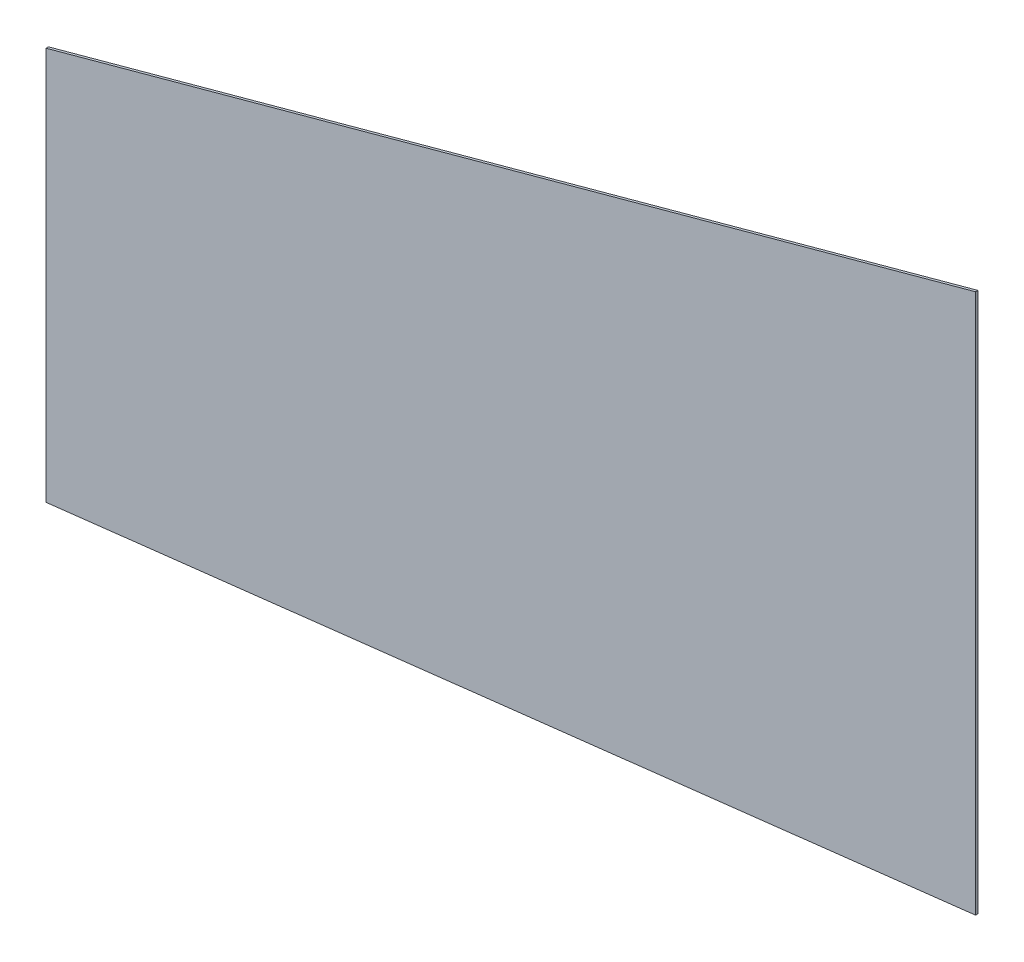
ISO-10303-21;
HEADER;
FILE_DESCRIPTION(('STEP AP214'),'2;1');
FILE_NAME('part.step','',(''),(''),'','','');
FILE_SCHEMA(('AUTOMOTIVE_DESIGN { 1 0 10303 214 1 1 1 1 }'));
ENDSEC;
DATA;
#1=APPLICATION_CONTEXT('core data for automotive mechanical design processes');
#2=APPLICATION_PROTOCOL_DEFINITION('international standard','automotive_design',2000,#1);
#3=PRODUCT_CONTEXT('',#1,'mechanical');
#4=PRODUCT('Part','Part','',(#3));
#5=PRODUCT_RELATED_PRODUCT_CATEGORY('part','',(#4));
#6=PRODUCT_DEFINITION_FORMATION('','',#4);
#7=PRODUCT_DEFINITION_CONTEXT('part definition',#1,'design');
#8=PRODUCT_DEFINITION('design','',#6,#7);
#9=PRODUCT_DEFINITION_SHAPE('','',#8);
#10=(LENGTH_UNIT() NAMED_UNIT(*) SI_UNIT(.MILLI.,.METRE.));
#11=(NAMED_UNIT(*) PLANE_ANGLE_UNIT() SI_UNIT($,.RADIAN.));
#12=(NAMED_UNIT(*) SI_UNIT($,.STERADIAN.) SOLID_ANGLE_UNIT());
#13=UNCERTAINTY_MEASURE_WITH_UNIT(LENGTH_MEASURE(1.E-05),#10,'distance_accuracy_value','');
#14=(GEOMETRIC_REPRESENTATION_CONTEXT(3) GLOBAL_UNCERTAINTY_ASSIGNED_CONTEXT((#13)) GLOBAL_UNIT_ASSIGNED_CONTEXT((#10,
#11,#12)) REPRESENTATION_CONTEXT('',''));
#15=CARTESIAN_POINT('',(0.,0.,0.));
#16=DIRECTION('',(0.,0.,1.));
#17=DIRECTION('',(1.,0.,0.));
#18=AXIS2_PLACEMENT_3D('',#15,#16,#17);
#19=CARTESIAN_POINT('',(780.,543.,2.));
#20=DIRECTION('',(0.26343134037037,-0.964678147835158,0.));
#21=DIRECTION('',(0.964678147835158,0.26343134037037,0.));
#22=AXIS2_PLACEMENT_3D('',#19,#20,#21);
#23=PLANE('',#22);
#24=DIRECTION('',(-0.964678147835158,-0.26343134037037,0.));
#25=VECTOR('',#24,1.);
#26=CARTESIAN_POINT('',(780.,543.,0.));
#27=LINE('',#26,#25);
#28=CARTESIAN_POINT('',(780.,543.,0.));
#29=VERTEX_POINT('',#28);
#30=CARTESIAN_POINT('',(0.,330.,0.));
#31=VERTEX_POINT('',#30);
#32=EDGE_CURVE('E107',#29,#31,#27,.T.);
#33=ORIENTED_EDGE('',*,*,#32,.T.);
#34=DIRECTION('',(0.,0.,-1.));
#35=VECTOR('',#34,1.);
#36=CARTESIAN_POINT('',(0.,330.,2.));
#37=LINE('',#36,#35);
#38=CARTESIAN_POINT('',(0.,330.,2.));
#39=VERTEX_POINT('',#38);
#40=EDGE_CURVE('E11',#39,#31,#37,.T.);
#41=ORIENTED_EDGE('',*,*,#40,.F.);
#42=DIRECTION('',(-0.964678147835158,-0.26343134037037,0.));
#43=VECTOR('',#42,1.);
#44=CARTESIAN_POINT('',(780.,543.,2.));
#45=LINE('',#44,#43);
#46=CARTESIAN_POINT('',(780.,543.,2.));
#47=VERTEX_POINT('',#46);
#48=EDGE_CURVE('E91',#47,#39,#45,.T.);
#49=ORIENTED_EDGE('',*,*,#48,.F.);
#50=DIRECTION('',(0.,0.,-1.));
#51=VECTOR('',#50,1.);
#52=CARTESIAN_POINT('',(780.,543.,2.));
#53=LINE('',#52,#51);
#54=EDGE_CURVE('E103',#47,#29,#53,.T.);
#55=ORIENTED_EDGE('',*,*,#54,.T.);
#56=EDGE_LOOP('',(#33,#41,#49,#55));
#57=FACE_BOUND('',#56,.T.);
#58=ADVANCED_FACE('F39',(#57),#23,.F.);
#59=CARTESIAN_POINT('',(0.,330.,2.));
#60=DIRECTION('',(1.,0.,0.));
#61=DIRECTION('',(0.,1.,0.));
#62=AXIS2_PLACEMENT_3D('',#59,#60,#61);
#63=PLANE('',#62);
#64=DIRECTION('',(0.,-1.,0.));
#65=VECTOR('',#64,1.);
#66=CARTESIAN_POINT('',(0.,330.,0.));
#67=LINE('',#66,#65);
#68=CARTESIAN_POINT('',(0.,0.,0.));
#69=VERTEX_POINT('',#68);
#70=EDGE_CURVE('E96',#31,#69,#67,.T.);
#71=ORIENTED_EDGE('',*,*,#70,.T.);
#72=DIRECTION('',(0.,0.,-1.));
#73=VECTOR('',#72,1.);
#74=CARTESIAN_POINT('',(0.,0.,2.));
#75=LINE('',#74,#73);
#76=CARTESIAN_POINT('',(0.,0.,2.));
#77=VERTEX_POINT('',#76);
#78=EDGE_CURVE('E48',#77,#69,#75,.T.);
#79=ORIENTED_EDGE('',*,*,#78,.F.);
#80=DIRECTION('',(0.,-1.,0.));
#81=VECTOR('',#80,1.);
#82=CARTESIAN_POINT('',(0.,330.,2.));
#83=LINE('',#82,#81);
#84=EDGE_CURVE('E86',#39,#77,#83,.T.);
#85=ORIENTED_EDGE('',*,*,#84,.F.);
#86=ORIENTED_EDGE('',*,*,#40,.T.);
#87=EDGE_LOOP('',(#71,#79,#85,#86));
#88=FACE_BOUND('',#87,.T.);
#89=ADVANCED_FACE('F95',(#88),#63,.F.);
#90=CARTESIAN_POINT('',(0.,0.,2.));
#91=DIRECTION('',(-0.11462410798513,0.993408935871131,0.));
#92=DIRECTION('',(-0.993408935871131,-0.11462410798513,0.));
#93=AXIS2_PLACEMENT_3D('',#90,#91,#92);
#94=PLANE('',#93);
#95=DIRECTION('',(0.993408935871131,0.11462410798513,0.));
#96=VECTOR('',#95,1.);
#97=CARTESIAN_POINT('',(0.,0.,0.));
#98=LINE('',#97,#96);
#99=CARTESIAN_POINT('',(780.,90.,0.));
#100=VERTEX_POINT('',#99);
#101=EDGE_CURVE('E73',#69,#100,#98,.T.);
#102=ORIENTED_EDGE('',*,*,#101,.T.);
#103=DIRECTION('',(0.,0.,-1.));
#104=VECTOR('',#103,1.);
#105=CARTESIAN_POINT('',(780.,90.,2.));
#106=LINE('',#105,#104);
#107=CARTESIAN_POINT('',(780.,90.,2.));
#108=VERTEX_POINT('',#107);
#109=EDGE_CURVE('E98',#108,#100,#106,.T.);
#110=ORIENTED_EDGE('',*,*,#109,.F.);
#111=DIRECTION('',(0.993408935871131,0.11462410798513,0.));
#112=VECTOR('',#111,1.);
#113=CARTESIAN_POINT('',(0.,0.,2.));
#114=LINE('',#113,#112);
#115=EDGE_CURVE('E89',#77,#108,#114,.T.);
#116=ORIENTED_EDGE('',*,*,#115,.F.);
#117=ORIENTED_EDGE('',*,*,#78,.T.);
#118=EDGE_LOOP('',(#102,#110,#116,#117));
#119=FACE_BOUND('',#118,.T.);
#120=ADVANCED_FACE('F99',(#119),#94,.F.);
#121=CARTESIAN_POINT('',(780.,90.,2.));
#122=DIRECTION('',(-1.,0.,0.));
#123=DIRECTION('',(0.,0.,1.));
#124=AXIS2_PLACEMENT_3D('',#121,#122,#123);
#125=PLANE('',#124);
#126=DIRECTION('',(0.,1.,0.));
#127=VECTOR('',#126,1.);
#128=CARTESIAN_POINT('',(780.,90.,0.));
#129=LINE('',#128,#127);
#130=EDGE_CURVE('E79',#100,#29,#129,.T.);
#131=ORIENTED_EDGE('',*,*,#130,.T.);
#132=ORIENTED_EDGE('',*,*,#54,.F.);
#133=DIRECTION('',(0.,1.,0.));
#134=VECTOR('',#133,1.);
#135=CARTESIAN_POINT('',(780.,90.,2.));
#136=LINE('',#135,#134);
#137=EDGE_CURVE('E56',#108,#47,#136,.T.);
#138=ORIENTED_EDGE('',*,*,#137,.F.);
#139=ORIENTED_EDGE('',*,*,#109,.T.);
#140=EDGE_LOOP('',(#131,#132,#138,#139));
#141=FACE_BOUND('',#140,.T.);
#142=ADVANCED_FACE('F120',(#141),#125,.F.);
#143=CARTESIAN_POINT('',(0.,0.,2.));
#144=DIRECTION('',(0.,0.,1.));
#145=DIRECTION('',(1.,0.,0.));
#146=AXIS2_PLACEMENT_3D('',#143,#144,#145);
#147=PLANE('',#146);
#148=ORIENTED_EDGE('',*,*,#48,.T.);
#149=ORIENTED_EDGE('',*,*,#84,.T.);
#150=ORIENTED_EDGE('',*,*,#115,.T.);
#151=ORIENTED_EDGE('',*,*,#137,.T.);
#152=EDGE_LOOP('',(#148,#149,#150,#151));
#153=FACE_BOUND('',#152,.T.);
#154=ADVANCED_FACE('F87',(#153),#147,.T.);
#155=CARTESIAN_POINT('',(0.,0.,0.));
#156=DIRECTION('',(0.,0.,1.));
#157=DIRECTION('',(1.,0.,0.));
#158=AXIS2_PLACEMENT_3D('',#155,#156,#157);
#159=PLANE('',#158);
#160=ORIENTED_EDGE('',*,*,#32,.F.);
#161=ORIENTED_EDGE('',*,*,#130,.F.);
#162=ORIENTED_EDGE('',*,*,#101,.F.);
#163=ORIENTED_EDGE('',*,*,#70,.F.);
#164=EDGE_LOOP('',(#160,#161,#162,#163));
#165=FACE_BOUND('',#164,.T.);
#166=ADVANCED_FACE('F123',(#165),#159,.F.);
#167=CLOSED_SHELL('',(#58,#89,#120,#142,#154,#166));
#168=MANIFOLD_SOLID_BREP('B2',#167);
#169=ADVANCED_BREP_SHAPE_REPRESENTATION('',(#18,#168),#14);
#170=SHAPE_DEFINITION_REPRESENTATION(#9,#169);
ENDSEC;
END-ISO-10303-21;
